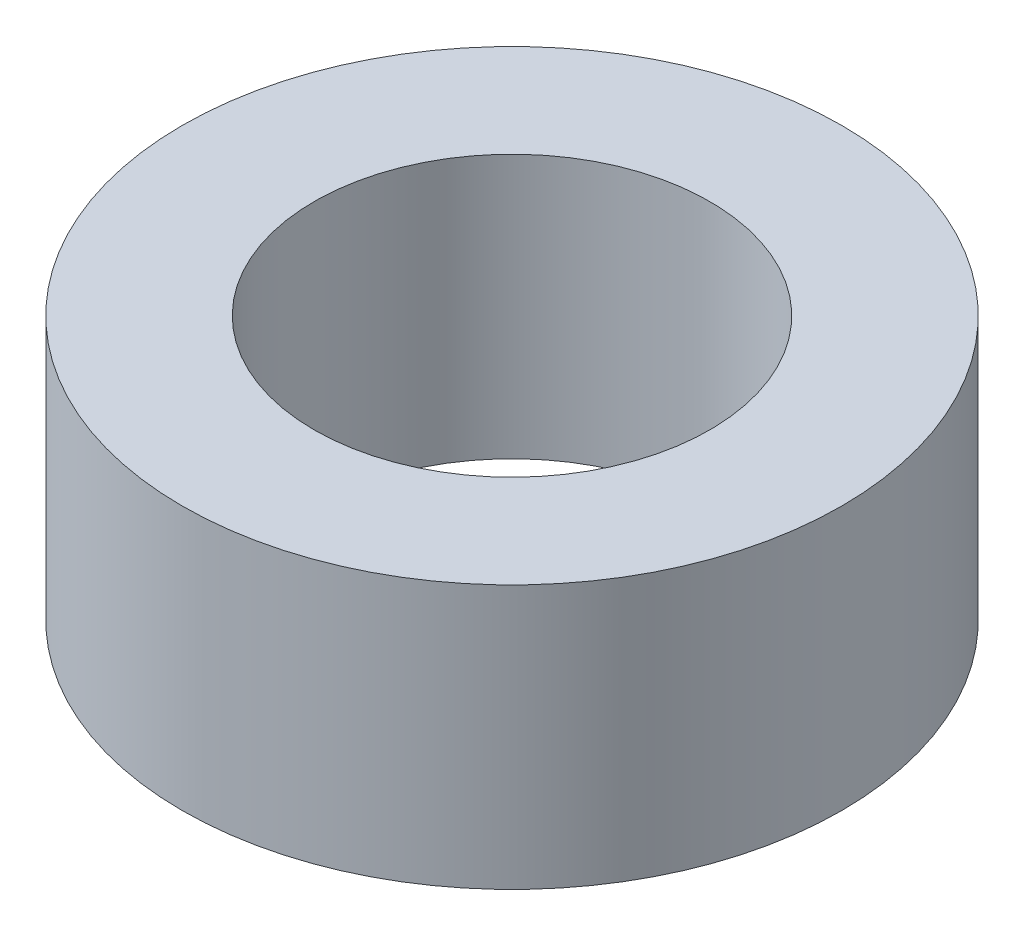
ISO-10303-21;
HEADER;
FILE_DESCRIPTION(('STEP AP214'),'2;1');
FILE_NAME('part.step','',(''),(''),'','','');
FILE_SCHEMA(('AUTOMOTIVE_DESIGN { 1 0 10303 214 1 1 1 1 }'));
ENDSEC;
DATA;
#1=APPLICATION_CONTEXT('core data for automotive mechanical design processes');
#2=APPLICATION_PROTOCOL_DEFINITION('international standard','automotive_design',2000,#1);
#3=PRODUCT_CONTEXT('',#1,'mechanical');
#4=PRODUCT('Part','Part','',(#3));
#5=PRODUCT_RELATED_PRODUCT_CATEGORY('part','',(#4));
#6=PRODUCT_DEFINITION_FORMATION('','',#4);
#7=PRODUCT_DEFINITION_CONTEXT('part definition',#1,'design');
#8=PRODUCT_DEFINITION('design','',#6,#7);
#9=PRODUCT_DEFINITION_SHAPE('','',#8);
#10=(LENGTH_UNIT() NAMED_UNIT(*) SI_UNIT(.MILLI.,.METRE.));
#11=(NAMED_UNIT(*) PLANE_ANGLE_UNIT() SI_UNIT($,.RADIAN.));
#12=(NAMED_UNIT(*) SI_UNIT($,.STERADIAN.) SOLID_ANGLE_UNIT());
#13=UNCERTAINTY_MEASURE_WITH_UNIT(LENGTH_MEASURE(1.E-05),#10,'distance_accuracy_value','');
#14=(GEOMETRIC_REPRESENTATION_CONTEXT(3) GLOBAL_UNCERTAINTY_ASSIGNED_CONTEXT((#13)) GLOBAL_UNIT_ASSIGNED_CONTEXT((#10,
#11,#12)) REPRESENTATION_CONTEXT('',''));
#15=CARTESIAN_POINT('',(0.,0.,0.));
#16=DIRECTION('',(0.,0.,1.));
#17=DIRECTION('',(1.,0.,0.));
#18=AXIS2_PLACEMENT_3D('',#15,#16,#17);
#19=CARTESIAN_POINT('',(0.,2.,0.));
#20=DIRECTION('',(0.,1.,0.));
#21=DIRECTION('',(0.,0.,1.));
#22=AXIS2_PLACEMENT_3D('',#19,#20,#21);
#23=PLANE('',#22);
#24=CARTESIAN_POINT('',(0.,2.,0.));
#25=DIRECTION('',(0.,1.,0.));
#26=DIRECTION('',(0.,0.,1.));
#27=AXIS2_PLACEMENT_3D('',#24,#25,#26);
#28=CIRCLE('',#27,2.5);
#29=CARTESIAN_POINT('',(0.,2.,2.5));
#30=VERTEX_POINT('',#29);
#31=EDGE_CURVE('E10',#30,#30,#28,.T.);
#32=ORIENTED_EDGE('',*,*,#31,.T.);
#33=EDGE_LOOP('',(#32));
#34=FACE_BOUND('',#33,.T.);
#35=CARTESIAN_POINT('',(0.,2.,0.));
#36=DIRECTION('',(0.,1.,0.));
#37=DIRECTION('',(0.,0.,1.));
#38=AXIS2_PLACEMENT_3D('',#35,#36,#37);
#39=CIRCLE('',#38,1.5);
#40=CARTESIAN_POINT('',(0.,2.,1.5));
#41=VERTEX_POINT('',#40);
#42=EDGE_CURVE('E44',#41,#41,#39,.T.);
#43=ORIENTED_EDGE('',*,*,#42,.F.);
#44=EDGE_LOOP('',(#43));
#45=FACE_BOUND('',#44,.T.);
#46=ADVANCED_FACE('F33',(#34,#45),#23,.T.);
#47=CARTESIAN_POINT('',(0.,0.,0.));
#48=DIRECTION('',(0.,1.,0.));
#49=DIRECTION('',(0.,0.,1.));
#50=AXIS2_PLACEMENT_3D('',#47,#48,#49);
#51=PLANE('',#50);
#52=CARTESIAN_POINT('',(0.,0.,0.));
#53=DIRECTION('',(0.,1.,0.));
#54=DIRECTION('',(0.,0.,1.));
#55=AXIS2_PLACEMENT_3D('',#52,#53,#54);
#56=CIRCLE('',#55,2.5);
#57=CARTESIAN_POINT('',(0.,0.,2.5));
#58=VERTEX_POINT('',#57);
#59=EDGE_CURVE('E37',#58,#58,#56,.T.);
#60=ORIENTED_EDGE('',*,*,#59,.F.);
#61=EDGE_LOOP('',(#60));
#62=FACE_BOUND('',#61,.T.);
#63=CARTESIAN_POINT('',(0.,0.,0.));
#64=DIRECTION('',(0.,1.,0.));
#65=DIRECTION('',(0.,0.,1.));
#66=AXIS2_PLACEMENT_3D('',#63,#64,#65);
#67=CIRCLE('',#66,1.5);
#68=CARTESIAN_POINT('',(0.,0.,1.5));
#69=VERTEX_POINT('',#68);
#70=EDGE_CURVE('E46',#69,#69,#67,.T.);
#71=ORIENTED_EDGE('',*,*,#70,.T.);
#72=EDGE_LOOP('',(#71));
#73=FACE_BOUND('',#72,.T.);
#74=ADVANCED_FACE('F56',(#62,#73),#51,.F.);
#75=CARTESIAN_POINT('',(0.,2.,0.));
#76=DIRECTION('',(0.,-1.,0.));
#77=DIRECTION('',(0.,0.,-1.));
#78=AXIS2_PLACEMENT_3D('',#75,#76,#77);
#79=CYLINDRICAL_SURFACE('',#78,2.5);
#80=ORIENTED_EDGE('',*,*,#31,.F.);
#81=EDGE_LOOP('',(#80));
#82=FACE_BOUND('',#81,.T.);
#83=ORIENTED_EDGE('',*,*,#59,.T.);
#84=EDGE_LOOP('',(#83));
#85=FACE_BOUND('',#84,.T.);
#86=ADVANCED_FACE('F35',(#82,#85),#79,.T.);
#87=CARTESIAN_POINT('',(0.,2.,0.));
#88=DIRECTION('',(0.,-1.,0.));
#89=DIRECTION('',(0.,0.,-1.));
#90=AXIS2_PLACEMENT_3D('',#87,#88,#89);
#91=CYLINDRICAL_SURFACE('',#90,1.5);
#92=ORIENTED_EDGE('',*,*,#42,.T.);
#93=EDGE_LOOP('',(#92));
#94=FACE_BOUND('',#93,.T.);
#95=ORIENTED_EDGE('',*,*,#70,.F.);
#96=EDGE_LOOP('',(#95));
#97=FACE_BOUND('',#96,.T.);
#98=ADVANCED_FACE('F52',(#94,#97),#91,.F.);
#99=CLOSED_SHELL('',(#46,#74,#86,#98));
#100=MANIFOLD_SOLID_BREP('B2',#99);
#101=ADVANCED_BREP_SHAPE_REPRESENTATION('',(#18,#100),#14);
#102=SHAPE_DEFINITION_REPRESENTATION(#9,#101);
ENDSEC;
END-ISO-10303-21;
